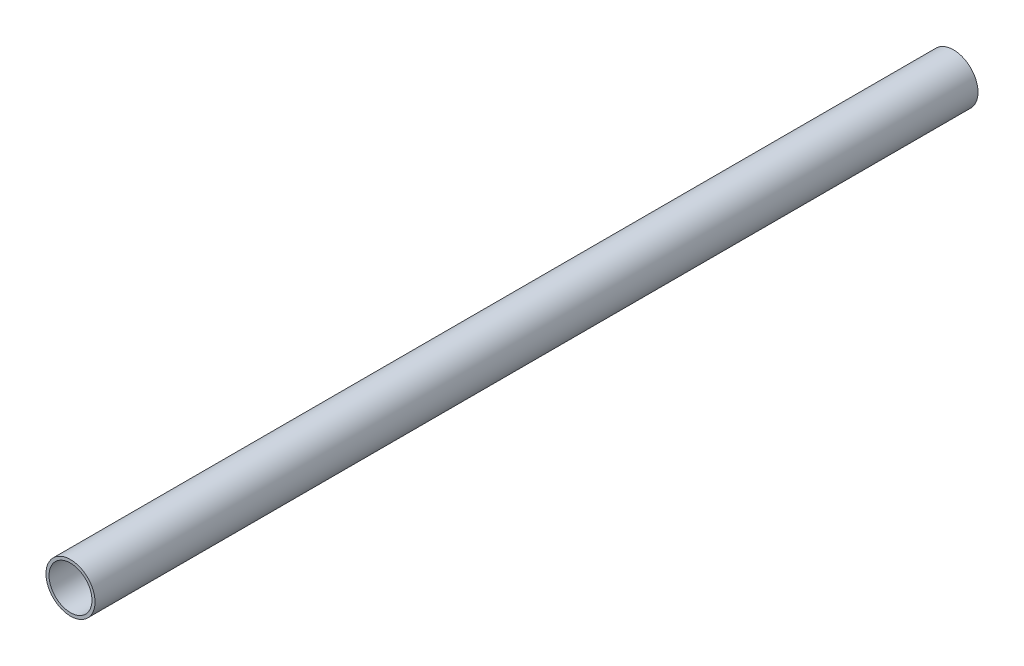
ISO-10303-21;
HEADER;
FILE_DESCRIPTION(('STEP AP214'),'2;1');
FILE_NAME('part.step','',(''),(''),'','','');
FILE_SCHEMA(('AUTOMOTIVE_DESIGN { 1 0 10303 214 1 1 1 1 }'));
ENDSEC;
DATA;
#1=APPLICATION_CONTEXT('core data for automotive mechanical design processes');
#2=APPLICATION_PROTOCOL_DEFINITION('international standard','automotive_design',2000,#1);
#3=PRODUCT_CONTEXT('',#1,'mechanical');
#4=PRODUCT('Part','Part','',(#3));
#5=PRODUCT_RELATED_PRODUCT_CATEGORY('part','',(#4));
#6=PRODUCT_DEFINITION_FORMATION('','',#4);
#7=PRODUCT_DEFINITION_CONTEXT('part definition',#1,'design');
#8=PRODUCT_DEFINITION('design','',#6,#7);
#9=PRODUCT_DEFINITION_SHAPE('','',#8);
#10=(LENGTH_UNIT() NAMED_UNIT(*) SI_UNIT(.MILLI.,.METRE.));
#11=(NAMED_UNIT(*) PLANE_ANGLE_UNIT() SI_UNIT($,.RADIAN.));
#12=(NAMED_UNIT(*) SI_UNIT($,.STERADIAN.) SOLID_ANGLE_UNIT());
#13=UNCERTAINTY_MEASURE_WITH_UNIT(LENGTH_MEASURE(1.E-05),#10,'distance_accuracy_value','');
#14=(GEOMETRIC_REPRESENTATION_CONTEXT(3) GLOBAL_UNCERTAINTY_ASSIGNED_CONTEXT((#13)) GLOBAL_UNIT_ASSIGNED_CONTEXT((#10,
#11,#12)) REPRESENTATION_CONTEXT('',''));
#15=CARTESIAN_POINT('',(0.,0.,0.));
#16=DIRECTION('',(0.,0.,1.));
#17=DIRECTION('',(1.,0.,0.));
#18=AXIS2_PLACEMENT_3D('',#15,#16,#17);
#19=CARTESIAN_POINT('',(0.,0.,457.2));
#20=DIRECTION('',(0.,0.,1.));
#21=DIRECTION('',(1.,0.,0.));
#22=AXIS2_PLACEMENT_3D('',#19,#20,#21);
#23=PLANE('',#22);
#24=CARTESIAN_POINT('',(0.,0.,457.2));
#25=DIRECTION('',(0.,0.,1.));
#26=DIRECTION('',(1.,0.,0.));
#27=AXIS2_PLACEMENT_3D('',#24,#25,#26);
#28=CIRCLE('',#27,12.7);
#29=CARTESIAN_POINT('',(12.7,0.,457.2));
#30=VERTEX_POINT('',#29);
#31=EDGE_CURVE('E10',#30,#30,#28,.T.);
#32=ORIENTED_EDGE('',*,*,#31,.T.);
#33=EDGE_LOOP('',(#32));
#34=FACE_BOUND('',#33,.T.);
#35=CARTESIAN_POINT('',(0.,0.,457.2));
#36=DIRECTION('',(0.,0.,1.));
#37=DIRECTION('',(1.,0.,0.));
#38=AXIS2_PLACEMENT_3D('',#35,#36,#37);
#39=CIRCLE('',#38,11.1125);
#40=CARTESIAN_POINT('',(11.1125,0.,457.2));
#41=VERTEX_POINT('',#40);
#42=EDGE_CURVE('E42',#41,#41,#39,.T.);
#43=ORIENTED_EDGE('',*,*,#42,.F.);
#44=EDGE_LOOP('',(#43));
#45=FACE_BOUND('',#44,.T.);
#46=ADVANCED_FACE('F31',(#34,#45),#23,.T.);
#47=CARTESIAN_POINT('',(0.,0.,0.));
#48=DIRECTION('',(0.,0.,1.));
#49=DIRECTION('',(1.,0.,0.));
#50=AXIS2_PLACEMENT_3D('',#47,#48,#49);
#51=PLANE('',#50);
#52=CARTESIAN_POINT('',(0.,0.,0.));
#53=DIRECTION('',(0.,0.,1.));
#54=DIRECTION('',(1.,0.,0.));
#55=AXIS2_PLACEMENT_3D('',#52,#53,#54);
#56=CIRCLE('',#55,12.7);
#57=CARTESIAN_POINT('',(12.7,0.,0.));
#58=VERTEX_POINT('',#57);
#59=EDGE_CURVE('E35',#58,#58,#56,.T.);
#60=ORIENTED_EDGE('',*,*,#59,.F.);
#61=EDGE_LOOP('',(#60));
#62=FACE_BOUND('',#61,.T.);
#63=CARTESIAN_POINT('',(0.,0.,0.));
#64=DIRECTION('',(0.,0.,1.));
#65=DIRECTION('',(1.,0.,0.));
#66=AXIS2_PLACEMENT_3D('',#63,#64,#65);
#67=CIRCLE('',#66,11.1125);
#68=CARTESIAN_POINT('',(11.1125,0.,0.));
#69=VERTEX_POINT('',#68);
#70=EDGE_CURVE('E44',#69,#69,#67,.T.);
#71=ORIENTED_EDGE('',*,*,#70,.T.);
#72=EDGE_LOOP('',(#71));
#73=FACE_BOUND('',#72,.T.);
#74=ADVANCED_FACE('F54',(#62,#73),#51,.F.);
#75=CARTESIAN_POINT('',(0.,0.,457.2));
#76=DIRECTION('',(0.,0.,-1.));
#77=DIRECTION('',(-1.,0.,0.));
#78=AXIS2_PLACEMENT_3D('',#75,#76,#77);
#79=CYLINDRICAL_SURFACE('',#78,12.7);
#80=ORIENTED_EDGE('',*,*,#31,.F.);
#81=EDGE_LOOP('',(#80));
#82=FACE_BOUND('',#81,.T.);
#83=ORIENTED_EDGE('',*,*,#59,.T.);
#84=EDGE_LOOP('',(#83));
#85=FACE_BOUND('',#84,.T.);
#86=ADVANCED_FACE('F33',(#82,#85),#79,.T.);
#87=CARTESIAN_POINT('',(0.,0.,457.2));
#88=DIRECTION('',(0.,0.,-1.));
#89=DIRECTION('',(-1.,0.,0.));
#90=AXIS2_PLACEMENT_3D('',#87,#88,#89);
#91=CYLINDRICAL_SURFACE('',#90,11.1125);
#92=ORIENTED_EDGE('',*,*,#42,.T.);
#93=EDGE_LOOP('',(#92));
#94=FACE_BOUND('',#93,.T.);
#95=ORIENTED_EDGE('',*,*,#70,.F.);
#96=EDGE_LOOP('',(#95));
#97=FACE_BOUND('',#96,.T.);
#98=ADVANCED_FACE('F50',(#94,#97),#91,.F.);
#99=CLOSED_SHELL('',(#46,#74,#86,#98));
#100=MANIFOLD_SOLID_BREP('B2',#99);
#101=ADVANCED_BREP_SHAPE_REPRESENTATION('',(#18,#100),#14);
#102=SHAPE_DEFINITION_REPRESENTATION(#9,#101);
ENDSEC;
END-ISO-10303-21;
